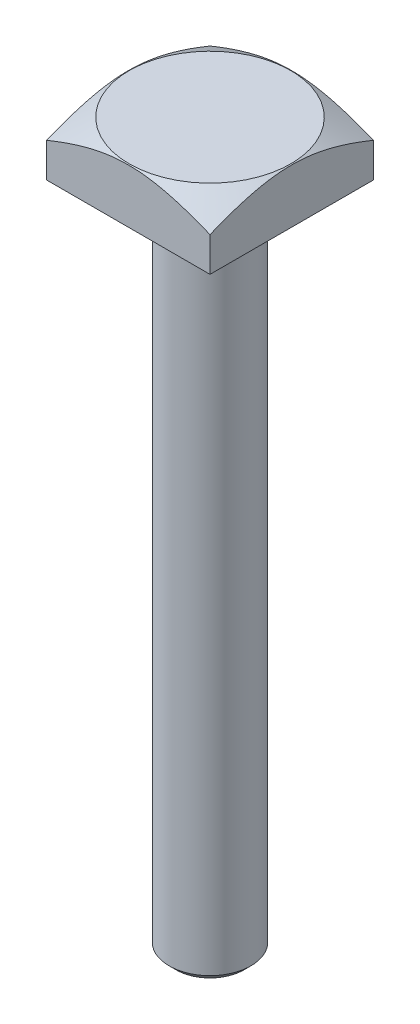
ISO-10303-21;
HEADER;
FILE_DESCRIPTION(('STEP AP214'),'2;1');
FILE_NAME('part.step','',(''),(''),'','','');
FILE_SCHEMA(('AUTOMOTIVE_DESIGN { 1 0 10303 214 1 1 1 1 }'));
ENDSEC;
DATA;
#1=APPLICATION_CONTEXT('core data for automotive mechanical design processes');
#2=APPLICATION_PROTOCOL_DEFINITION('international standard','automotive_design',2000,#1);
#3=PRODUCT_CONTEXT('',#1,'mechanical');
#4=PRODUCT('Part','Part','',(#3));
#5=PRODUCT_RELATED_PRODUCT_CATEGORY('part','',(#4));
#6=PRODUCT_DEFINITION_FORMATION('','',#4);
#7=PRODUCT_DEFINITION_CONTEXT('part definition',#1,'design');
#8=PRODUCT_DEFINITION('design','',#6,#7);
#9=PRODUCT_DEFINITION_SHAPE('','',#8);
#10=(LENGTH_UNIT() NAMED_UNIT(*) SI_UNIT(.MILLI.,.METRE.));
#11=(NAMED_UNIT(*) PLANE_ANGLE_UNIT() SI_UNIT($,.RADIAN.));
#12=(NAMED_UNIT(*) SI_UNIT($,.STERADIAN.) SOLID_ANGLE_UNIT());
#13=UNCERTAINTY_MEASURE_WITH_UNIT(LENGTH_MEASURE(1.E-05),#10,'distance_accuracy_value','');
#14=(GEOMETRIC_REPRESENTATION_CONTEXT(3) GLOBAL_UNCERTAINTY_ASSIGNED_CONTEXT((#13)) GLOBAL_UNIT_ASSIGNED_CONTEXT((#10,
#11,#12)) REPRESENTATION_CONTEXT('',''));
#15=CARTESIAN_POINT('',(0.,0.,0.));
#16=DIRECTION('',(0.,0.,1.));
#17=DIRECTION('',(1.,0.,0.));
#18=AXIS2_PLACEMENT_3D('',#15,#16,#17);
#19=CARTESIAN_POINT('',(12.,8.,-12.));
#20=DIRECTION('',(-1.,0.,0.));
#21=DIRECTION('',(0.,0.,1.));
#22=AXIS2_PLACEMENT_3D('',#19,#20,#21);
#23=PLANE('',#22);
#24=CARTESIAN_POINT('',(12.,-7.755830649675,37.2802409115802));
#25=CARTESIAN_POINT('',(12.,-7.30241454304762,36.4551629177045));
#26=CARTESIAN_POINT('',(12.,-6.85003759237768,35.6295114864057));
#27=CARTESIAN_POINT('',(12.,-5.94791925450552,33.9767562738539));
#28=CARTESIAN_POINT('',(12.,-5.49817790221136,33.1496524735522));
#29=CARTESIAN_POINT('',(12.,-4.60165489076007,31.4932559321793));
#30=CARTESIAN_POINT('',(12.,-4.15487498514848,30.6639622412243));
#31=CARTESIAN_POINT('',(12.,-3.26531610211714,29.0032360151955));
#32=CARTESIAN_POINT('',(12.,-2.82253710291332,28.1718034917988));
#33=CARTESIAN_POINT('',(12.,-1.93297438809273,26.4891505562822));
#34=CARTESIAN_POINT('',(12.,-1.48629542789472,25.6378746856343));
#35=CARTESIAN_POINT('',(12.,-0.599734399658517,23.9317937330327));
#36=CARTESIAN_POINT('',(12.,-0.159852287589864,23.0769886739867));
#37=CARTESIAN_POINT('',(12.,0.710859758166972,21.3630193062337));
#38=CARTESIAN_POINT('',(12.,1.14169182072157,20.5038560831051));
#39=CARTESIAN_POINT('',(12.,1.77882260657401,19.2106313435901));
#40=CARTESIAN_POINT('',(12.,1.98967781207068,18.7788143491524));
#41=CARTESIAN_POINT('',(12.,2.40780038432779,17.9134482002784));
#42=CARTESIAN_POINT('',(12.,2.61506777620249,17.4798990579932));
#43=CARTESIAN_POINT('',(12.,3.03000425677916,16.6009712662702));
#44=CARTESIAN_POINT('',(12.,3.23757644887203,16.1555468057721));
#45=CARTESIAN_POINT('',(12.,3.64741511531173,15.2622675195519));
#46=CARTESIAN_POINT('',(12.,3.84968167212273,14.8144127317346));
#47=CARTESIAN_POINT('',(12.,4.24787985761422,13.9157332902921));
#48=CARTESIAN_POINT('',(12.,4.44380962845693,13.4649078115174));
#49=CARTESIAN_POINT('',(12.,4.82789729255058,12.5599509818219));
#50=CARTESIAN_POINT('',(12.,5.01605522286551,12.105819646679));
#51=CARTESIAN_POINT('',(12.,5.38216202035867,11.1954668212976));
#52=CARTESIAN_POINT('',(12.,5.56014726145397,10.7392600191031));
#53=CARTESIAN_POINT('',(12.,5.90453004084652,9.82245526618768));
#54=CARTESIAN_POINT('',(12.,6.07092714966156,9.36185715343337));
#55=CARTESIAN_POINT('',(12.,6.38938626877827,8.43583546512396));
#56=CARTESIAN_POINT('',(12.,6.54145237658143,7.9704133113556));
#57=CARTESIAN_POINT('',(12.,6.8279838170143,7.03423462562651));
#58=CARTESIAN_POINT('',(12.,6.962451081352,6.56347868529376));
#59=CARTESIAN_POINT('',(12.,7.25763009813,5.43365829223021));
#60=CARTESIAN_POINT('',(12.,7.40849398410238,4.77191925666861));
#61=CARTESIAN_POINT('',(12.,7.59535070976626,3.772085443082));
#62=CARTESIAN_POINT('',(12.,7.65106048199936,3.43762789346317));
#63=CARTESIAN_POINT('',(12.,7.74802179763537,2.76659531974961));
#64=CARTESIAN_POINT('',(12.,7.78927342363181,2.43002030776228));
#65=CARTESIAN_POINT('',(12.,7.85600273437088,1.75724545998452));
#66=CARTESIAN_POINT('',(12.,7.88156933724223,1.421054499667));
#67=CARTESIAN_POINT('',(12.,7.91655140035061,0.747830808754621));
#68=CARTESIAN_POINT('',(12.,7.92596714576254,0.410798093127814));
#69=CARTESIAN_POINT('',(12.,7.92835804465415,-0.263326108606828));
#70=CARTESIAN_POINT('',(12.,7.92133327195475,-0.600417594443979));
#71=CARTESIAN_POINT('',(12.,7.89106337574009,-1.27387197433406));
#72=CARTESIAN_POINT('',(12.,7.86781759091782,-1.6102348381213));
#73=CARTESIAN_POINT('',(12.,7.79672553128797,-2.37944693684561));
#74=CARTESIAN_POINT('',(12.,7.74368116579182,-2.81181972831901));
#75=CARTESIAN_POINT('',(12.,7.61399690734149,-3.67300629551294));
#76=CARTESIAN_POINT('',(12.,7.53735399363033,-4.10181960837781));
#77=CARTESIAN_POINT('',(12.,7.36332659079184,-4.95555764845053));
#78=CARTESIAN_POINT('',(12.,7.26592428654824,-5.38047870668094));
#79=CARTESIAN_POINT('',(12.,7.05344369590148,-6.2258292267736));
#80=CARTESIAN_POINT('',(12.,6.93836565245686,-6.64625875028845));
#81=CARTESIAN_POINT('',(12.,6.69082941504958,-7.49137732991198));
#82=CARTESIAN_POINT('',(12.,6.55806129598559,-7.91597496421117));
#83=CARTESIAN_POINT('',(12.,6.27969141105413,-8.76091736794835));
#84=CARTESIAN_POINT('',(12.,6.1340895937559,-9.1812621203355));
#85=CARTESIAN_POINT('',(12.,5.83233533866863,-10.0179335154725));
#86=CARTESIAN_POINT('',(12.,5.67618727983331,-10.4342617448728));
#87=CARTESIAN_POINT('',(12.,5.35511246911133,-11.26349957583));
#88=CARTESIAN_POINT('',(12.,5.19018581950202,-11.6764092171512));
#89=CARTESIAN_POINT('',(12.,4.78869511646332,-12.6563085401857));
#90=CARTESIAN_POINT('',(12.,4.54882012355107,-13.2219396121394));
#91=CARTESIAN_POINT('',(12.,4.05823270102751,-14.3484956884947));
#92=CARTESIAN_POINT('',(12.,3.80751964000225,-14.9094204164304));
#93=CARTESIAN_POINT('',(12.,3.29748935255508,-16.0274761772401));
#94=CARTESIAN_POINT('',(12.,3.03817033707768,-16.584606391907));
#95=CARTESIAN_POINT('',(12.,2.51270633552729,-17.6956167271159));
#96=CARTESIAN_POINT('',(12.,2.24656148938847,-18.2494969140001));
#97=CARTESIAN_POINT('',(12.,1.70847111747003,-19.3551374256665));
#98=CARTESIAN_POINT('',(12.,1.43651987068159,-19.9068949615636));
#99=CARTESIAN_POINT('',(12.,0.888093164661973,-21.0081568104106));
#100=CARTESIAN_POINT('',(12.,0.611617686686798,-21.5576611140134));
#101=CARTESIAN_POINT('',(12.,0.0549648637203552,-22.65470566547));
#102=CARTESIAN_POINT('',(12.,-0.225212027326439,-23.2022461438864));
#103=CARTESIAN_POINT('',(12.,-0.788685850139737,-24.2957201475609));
#104=CARTESIAN_POINT('',(12.,-1.07198279255229,-24.8416536673277));
#105=CARTESIAN_POINT('',(12.,-1.87797024125886,-26.3857842190039));
#106=CARTESIAN_POINT('',(12.,-2.40374020345778,-27.3823738119501));
#107=CARTESIAN_POINT('',(12.,-3.46181277844356,-29.3721143135459));
#108=CARTESIAN_POINT('',(12.,-3.99411561013151,-30.3652651055318));
#109=CARTESIAN_POINT('',(12.,-5.06248323800288,-32.3466044950721));
#110=CARTESIAN_POINT('',(12.,-5.59853662597048,-33.3347992479941));
#111=CARTESIAN_POINT('',(12.,-6.4055105495303,-34.8154803125457));
#112=CARTESIAN_POINT('',(12.,-6.67497744690058,-35.308759945488));
#113=CARTESIAN_POINT('',(12.,-7.21477867756769,-36.2948435561037));
#114=CARTESIAN_POINT('',(12.,-7.48511300972371,-36.7876475344015));
#115=CARTESIAN_POINT('',(12.,-7.755830649675,-37.2802409115802));
#116=B_SPLINE_CURVE_WITH_KNOTS('',3,(#24,#25,#26,#27,#28,#29,#30,#31,#32,#33,#34,#35,#36,#37,
#38,#39,#40,#41,#42,#43,#44,#45,#46,#47,#48,#49,#50,#51,#52,#53,#54,#55,#56,#57,#58,#59,#60,#61,
#62,#63,#64,#65,#66,#67,#68,#69,#70,#71,#72,#73,#74,#75,#76,#77,#78,#79,#80,#81,#82,#83,#84,#85,
#86,#87,#88,#89,#90,#91,#92,#93,#94,#95,#96,#97,#98,#99,#100,#101,#102,#103,#104,#105,#106,#107,
#108,#109,#110,#111,#112,#113,#114,#115),.UNSPECIFIED.,.F.,.F.,(4,2,2,2,2,2,2,2,2,2,2,2,2,2,2,2,
2,2,2,2,2,2,2,2,2,2,2,2,2,2,2,2,2,2,2,2,2,2,2,2,2,2,2,2,2,4),(0.,2.824371092826,
5.64877950979768,8.47473290004721,11.3006708943163,14.1846949859908,17.0687003869168,
19.9520196017731,21.3936488559899,22.8352680148885,24.30948561783,25.7836802937782,
27.2583033310779,28.7329193350716,30.2018819629076,31.6708990048569,33.1394947448832,
34.6079291514902,36.6421016751555,37.6590399606409,38.675972436675,39.6870853426842,
40.6981803953388,41.7092709080008,42.7204026437565,44.0264893648571,45.3327433425173,
46.640122856494,47.9474844017407,49.2818529918624,50.616226929678,51.9500501821787,
53.28385789801,55.1268804595321,56.9700105386138,58.8135262084138,60.6570041150507,
62.5023908663634,64.3477852650985,66.1929554061944,68.0381318452193,71.4184238723544,
74.7988294760449,78.1714929325083,79.8577410403608,81.54398693145),.UNSPECIFIED.);
#117=CARTESIAN_POINT('',(12.,5.05753764692432,12.));
#118=VERTEX_POINT('',#117);
#119=CARTESIAN_POINT('',(12.,5.05753764692432,-12.));
#120=VERTEX_POINT('',#119);
#121=EDGE_CURVE('E83',#118,#120,#116,.T.);
#122=ORIENTED_EDGE('',*,*,#121,.F.);
#123=DIRECTION('',(0.,-1.,0.));
#124=VECTOR('',#123,1.);
#125=CARTESIAN_POINT('',(12.,8.,12.));
#126=LINE('',#125,#124);
#127=CARTESIAN_POINT('',(12.,0.,12.));
#128=VERTEX_POINT('',#127);
#129=EDGE_CURVE('E64',#118,#128,#126,.T.);
#130=ORIENTED_EDGE('',*,*,#129,.T.);
#131=DIRECTION('',(0.,0.,-1.));
#132=VECTOR('',#131,1.);
#133=CARTESIAN_POINT('',(12.,0.,-12.));
#134=LINE('',#133,#132);
#135=CARTESIAN_POINT('',(12.,0.,-12.));
#136=VERTEX_POINT('',#135);
#137=EDGE_CURVE('E91',#128,#136,#134,.T.);
#138=ORIENTED_EDGE('',*,*,#137,.T.);
#139=DIRECTION('',(0.,-1.,0.));
#140=VECTOR('',#139,1.);
#141=CARTESIAN_POINT('',(12.,8.,-12.));
#142=LINE('',#141,#140);
#143=EDGE_CURVE('E90',#120,#136,#142,.T.);
#144=ORIENTED_EDGE('',*,*,#143,.F.);
#145=EDGE_LOOP('',(#122,#130,#138,#144));
#146=FACE_BOUND('',#145,.T.);
#147=ADVANCED_FACE('F40',(#146),#23,.F.);
#148=CARTESIAN_POINT('',(-12.,8.,-12.));
#149=DIRECTION('',(0.,0.,1.));
#150=DIRECTION('',(1.,0.,0.));
#151=AXIS2_PLACEMENT_3D('',#148,#149,#150);
#152=PLANE('',#151);
#153=CARTESIAN_POINT('',(37.2802409115802,-7.755830649675,-12.));
#154=CARTESIAN_POINT('',(36.4551629177045,-7.30241454304762,-12.));
#155=CARTESIAN_POINT('',(35.6295114864057,-6.85003759237767,-12.));
#156=CARTESIAN_POINT('',(33.9767562738539,-5.94791925450552,-12.));
#157=CARTESIAN_POINT('',(33.1496524735522,-5.49817790221136,-12.));
#158=CARTESIAN_POINT('',(31.4932559321792,-4.60165489076007,-12.));
#159=CARTESIAN_POINT('',(30.6639622412243,-4.15487498514848,-12.));
#160=CARTESIAN_POINT('',(29.0032360151955,-3.26531610211713,-12.));
#161=CARTESIAN_POINT('',(28.1718034917988,-2.82253710291331,-12.));
#162=CARTESIAN_POINT('',(26.4891505562821,-1.93297438809272,-12.));
#163=CARTESIAN_POINT('',(25.6378746856343,-1.48629542789471,-12.));
#164=CARTESIAN_POINT('',(23.9317937330326,-0.59973439965851,-12.));
#165=CARTESIAN_POINT('',(23.0769886739867,-0.159852287589854,-12.));
#166=CARTESIAN_POINT('',(21.3630193062336,0.710859758166982,-12.));
#167=CARTESIAN_POINT('',(20.5038560831051,1.14169182072158,-12.));
#168=CARTESIAN_POINT('',(19.2106313435901,1.77882260657402,-12.));
#169=CARTESIAN_POINT('',(18.7788143491524,1.98967781207069,-12.));
#170=CARTESIAN_POINT('',(17.9134482002784,2.40780038432779,-12.));
#171=CARTESIAN_POINT('',(17.4798990579932,2.61506777620249,-12.));
#172=CARTESIAN_POINT('',(16.6009712662702,3.03000425677916,-12.));
#173=CARTESIAN_POINT('',(16.1555468057721,3.23757644887203,-12.));
#174=CARTESIAN_POINT('',(15.2622675195519,3.64741511531173,-12.));
#175=CARTESIAN_POINT('',(14.8144127317346,3.84968167212273,-12.));
#176=CARTESIAN_POINT('',(13.9157332902921,4.24787985761421,-12.));
#177=CARTESIAN_POINT('',(13.4649078115174,4.44380962845693,-12.));
#178=CARTESIAN_POINT('',(12.559950981822,4.82789729255058,-12.));
#179=CARTESIAN_POINT('',(12.105819646679,5.01605522286551,-12.));
#180=CARTESIAN_POINT('',(11.1954668212976,5.38216202035867,-12.));
#181=CARTESIAN_POINT('',(10.7392600191031,5.56014726145396,-12.));
#182=CARTESIAN_POINT('',(9.82245526618769,5.90453004084652,-12.));
#183=CARTESIAN_POINT('',(9.36185715343338,6.07092714966155,-12.));
#184=CARTESIAN_POINT('',(8.43583546512397,6.38938626877827,-12.));
#185=CARTESIAN_POINT('',(7.9704133113556,6.54145237658143,-12.));
#186=CARTESIAN_POINT('',(7.03423462562651,6.8279838170143,-12.));
#187=CARTESIAN_POINT('',(6.56347868529376,6.962451081352,-12.));
#188=CARTESIAN_POINT('',(5.43365829223021,7.25763009813,-12.));
#189=CARTESIAN_POINT('',(4.77191925666861,7.40849398410238,-12.));
#190=CARTESIAN_POINT('',(3.772085443082,7.59535070976626,-12.));
#191=CARTESIAN_POINT('',(3.43762789346316,7.65106048199936,-12.));
#192=CARTESIAN_POINT('',(2.76659531974961,7.74802179763537,-12.));
#193=CARTESIAN_POINT('',(2.43002030776228,7.78927342363181,-12.));
#194=CARTESIAN_POINT('',(1.75724545998451,7.85600273437088,-12.));
#195=CARTESIAN_POINT('',(1.421054499667,7.88156933724223,-12.));
#196=CARTESIAN_POINT('',(0.74783080875462,7.91655140035061,-12.));
#197=CARTESIAN_POINT('',(0.410798093127815,7.92596714576254,-12.));
#198=CARTESIAN_POINT('',(-0.263326108606826,7.92835804465415,-12.));
#199=CARTESIAN_POINT('',(-0.600417594443977,7.92133327195475,-12.));
#200=CARTESIAN_POINT('',(-1.27387197433406,7.89106337574009,-12.));
#201=CARTESIAN_POINT('',(-1.6102348381213,7.86781759091782,-12.));
#202=CARTESIAN_POINT('',(-2.3794469368456,7.79672553128797,-12.));
#203=CARTESIAN_POINT('',(-2.811819728319,7.74368116579182,-12.));
#204=CARTESIAN_POINT('',(-3.67300629551293,7.6139969073415,-12.));
#205=CARTESIAN_POINT('',(-4.10181960837781,7.53735399363033,-12.));
#206=CARTESIAN_POINT('',(-4.95555764845052,7.36332659079185,-12.));
#207=CARTESIAN_POINT('',(-5.38047870668094,7.26592428654824,-12.));
#208=CARTESIAN_POINT('',(-6.2258292267736,7.05344369590148,-12.));
#209=CARTESIAN_POINT('',(-6.64625875028845,6.93836565245686,-12.));
#210=CARTESIAN_POINT('',(-7.49137732991197,6.69082941504958,-12.));
#211=CARTESIAN_POINT('',(-7.91597496421116,6.55806129598559,-12.));
#212=CARTESIAN_POINT('',(-8.76091736794835,6.27969141105413,-12.));
#213=CARTESIAN_POINT('',(-9.18126212033549,6.13408959375591,-12.));
#214=CARTESIAN_POINT('',(-10.0179335154725,5.83233533866863,-12.));
#215=CARTESIAN_POINT('',(-10.4342617448728,5.67618727983331,-12.));
#216=CARTESIAN_POINT('',(-11.26349957583,5.35511246911133,-12.));
#217=CARTESIAN_POINT('',(-11.6764092171512,5.19018581950202,-12.));
#218=CARTESIAN_POINT('',(-12.6563085401857,4.78869511646333,-12.));
#219=CARTESIAN_POINT('',(-13.2219396121394,4.54882012355107,-12.));
#220=CARTESIAN_POINT('',(-14.3484956884947,4.05823270102751,-12.));
#221=CARTESIAN_POINT('',(-14.9094204164304,3.80751964000225,-12.));
#222=CARTESIAN_POINT('',(-16.0274761772401,3.29748935255508,-12.));
#223=CARTESIAN_POINT('',(-16.584606391907,3.03817033707768,-12.));
#224=CARTESIAN_POINT('',(-17.6956167271159,2.51270633552729,-12.));
#225=CARTESIAN_POINT('',(-18.2494969140001,2.24656148938847,-12.));
#226=CARTESIAN_POINT('',(-19.3551374256665,1.70847111747003,-12.));
#227=CARTESIAN_POINT('',(-19.9068949615636,1.43651987068158,-12.));
#228=CARTESIAN_POINT('',(-21.0081568104106,0.88809316466197,-12.));
#229=CARTESIAN_POINT('',(-21.5576611140134,0.611617686686792,-12.));
#230=CARTESIAN_POINT('',(-22.65470566547,0.0549648637203485,-12.));
#231=CARTESIAN_POINT('',(-23.2022461438864,-0.225212027326445,-12.));
#232=CARTESIAN_POINT('',(-24.2957201475609,-0.788685850139742,-12.));
#233=CARTESIAN_POINT('',(-24.8416536673277,-1.0719827925523,-12.));
#234=CARTESIAN_POINT('',(-26.3857842190039,-1.87797024125887,-12.));
#235=CARTESIAN_POINT('',(-27.3823738119501,-2.40374020345779,-12.));
#236=CARTESIAN_POINT('',(-29.3721143135459,-3.46181277844357,-12.));
#237=CARTESIAN_POINT('',(-30.3652651055318,-3.99411561013151,-12.));
#238=CARTESIAN_POINT('',(-32.3466044950721,-5.06248323800288,-12.));
#239=CARTESIAN_POINT('',(-33.3347992479941,-5.59853662597048,-12.));
#240=CARTESIAN_POINT('',(-34.8154803125457,-6.4055105495303,-12.));
#241=CARTESIAN_POINT('',(-35.308759945488,-6.67497744690058,-12.));
#242=CARTESIAN_POINT('',(-36.2948435561037,-7.21477867756769,-12.));
#243=CARTESIAN_POINT('',(-36.7876475344015,-7.48511300972371,-12.));
#244=CARTESIAN_POINT('',(-37.2802409115802,-7.755830649675,-12.));
#245=B_SPLINE_CURVE_WITH_KNOTS('',3,(#153,#154,#155,#156,#157,#158,#159,#160,#161,#162,#163,
#164,#165,#166,#167,#168,#169,#170,#171,#172,#173,#174,#175,#176,#177,#178,#179,#180,#181,#182,
#183,#184,#185,#186,#187,#188,#189,#190,#191,#192,#193,#194,#195,#196,#197,#198,#199,#200,#201,
#202,#203,#204,#205,#206,#207,#208,#209,#210,#211,#212,#213,#214,#215,#216,#217,#218,#219,#220,
#221,#222,#223,#224,#225,#226,#227,#228,#229,#230,#231,#232,#233,#234,#235,#236,#237,#238,#239,
#240,#241,#242,#243,#244),.UNSPECIFIED.,.F.,.F.,(4,2,2,2,2,2,2,2,2,2,2,2,2,2,2,2,2,2,2,2,2,2,2,
2,2,2,2,2,2,2,2,2,2,2,2,2,2,2,2,2,2,2,2,2,2,4),(0.,2.82437109282601,5.64877950979768,
8.47473290004722,11.3006708943163,14.1846949859908,17.0687003869169,19.9520196017732,
21.3936488559899,22.8352680148885,24.30948561783,25.7836802937782,27.2583033310779,
28.7329193350716,30.2018819629076,31.6708990048569,33.1394947448832,34.6079291514902,
36.6421016751555,37.659039960641,38.675972436675,39.6870853426842,40.6981803953388,
41.7092709080008,42.7204026437565,44.0264893648571,45.3327433425173,46.640122856494,
47.9474844017407,49.2818529918624,50.616226929678,51.9500501821787,53.28385789801,
55.1268804595321,56.9700105386138,58.8135262084139,60.6570041150507,62.5023908663634,
64.3477852650985,66.1929554061944,68.0381318452193,71.4184238723544,74.7988294760449,
78.1714929325083,79.8577410403608,81.54398693145),.UNSPECIFIED.);
#246=CARTESIAN_POINT('',(-12.,5.05753764692432,-12.));
#247=VERTEX_POINT('',#246);
#248=EDGE_CURVE('E92',#120,#247,#245,.T.);
#249=ORIENTED_EDGE('',*,*,#248,.F.);
#250=ORIENTED_EDGE('',*,*,#143,.T.);
#251=DIRECTION('',(-1.,0.,0.));
#252=VECTOR('',#251,1.);
#253=CARTESIAN_POINT('',(-12.,0.,-12.));
#254=LINE('',#253,#252);
#255=CARTESIAN_POINT('',(-12.,0.,-12.));
#256=VERTEX_POINT('',#255);
#257=EDGE_CURVE('E262',#136,#256,#254,.T.);
#258=ORIENTED_EDGE('',*,*,#257,.T.);
#259=DIRECTION('',(0.,-1.,0.));
#260=VECTOR('',#259,1.);
#261=CARTESIAN_POINT('',(-12.,8.,-12.));
#262=LINE('',#261,#260);
#263=EDGE_CURVE('E100',#247,#256,#262,.T.);
#264=ORIENTED_EDGE('',*,*,#263,.F.);
#265=EDGE_LOOP('',(#249,#250,#258,#264));
#266=FACE_BOUND('',#265,.T.);
#267=ADVANCED_FACE('F154',(#266),#152,.F.);
#268=CARTESIAN_POINT('',(-12.,8.,-12.));
#269=DIRECTION('',(1.,0.,0.));
#270=DIRECTION('',(0.,0.,-1.));
#271=AXIS2_PLACEMENT_3D('',#268,#269,#270);
#272=PLANE('',#271);
#273=CARTESIAN_POINT('',(-12.,-7.755830649675,-37.2802409115802));
#274=CARTESIAN_POINT('',(-12.,-7.30241454304762,-36.4551629177045));
#275=CARTESIAN_POINT('',(-12.,-6.85003759237767,-35.6295114864057));
#276=CARTESIAN_POINT('',(-12.,-5.94791925450552,-33.9767562738539));
#277=CARTESIAN_POINT('',(-12.,-5.49817790221136,-33.1496524735522));
#278=CARTESIAN_POINT('',(-12.,-4.60165489076007,-31.4932559321792));
#279=CARTESIAN_POINT('',(-12.,-4.15487498514847,-30.6639622412243));
#280=CARTESIAN_POINT('',(-12.,-3.26531610211712,-29.0032360151955));
#281=CARTESIAN_POINT('',(-12.,-2.82253710291331,-28.1718034917988));
#282=CARTESIAN_POINT('',(-12.,-1.93297438809272,-26.4891505562821));
#283=CARTESIAN_POINT('',(-12.,-1.48629542789471,-25.6378746856343));
#284=CARTESIAN_POINT('',(-12.,-0.599734399658513,-23.9317937330327));
#285=CARTESIAN_POINT('',(-12.,-0.159852287589857,-23.0769886739867));
#286=CARTESIAN_POINT('',(-12.,0.710859758166979,-21.3630193062336));
#287=CARTESIAN_POINT('',(-12.,1.14169182072158,-20.5038560831051));
#288=CARTESIAN_POINT('',(-12.,1.77882260657401,-19.2106313435901));
#289=CARTESIAN_POINT('',(-12.,1.98967781207069,-18.7788143491524));
#290=CARTESIAN_POINT('',(-12.,2.40780038432779,-17.9134482002784));
#291=CARTESIAN_POINT('',(-12.,2.61506777620249,-17.4798990579932));
#292=CARTESIAN_POINT('',(-12.,3.03000425677916,-16.6009712662702));
#293=CARTESIAN_POINT('',(-12.,3.23757644887203,-16.1555468057721));
#294=CARTESIAN_POINT('',(-12.,3.64741511531173,-15.2622675195519));
#295=CARTESIAN_POINT('',(-12.,3.84968167212273,-14.8144127317346));
#296=CARTESIAN_POINT('',(-12.,4.24787985761422,-13.9157332902921));
#297=CARTESIAN_POINT('',(-12.,4.44380962845693,-13.4649078115174));
#298=CARTESIAN_POINT('',(-12.,4.82789729255058,-12.5599509818219));
#299=CARTESIAN_POINT('',(-12.,5.01605522286551,-12.105819646679));
#300=CARTESIAN_POINT('',(-12.,5.38216202035867,-11.1954668212976));
#301=CARTESIAN_POINT('',(-12.,5.56014726145397,-10.7392600191031));
#302=CARTESIAN_POINT('',(-12.,5.90453004084652,-9.82245526618768));
#303=CARTESIAN_POINT('',(-12.,6.07092714966156,-9.36185715343337));
#304=CARTESIAN_POINT('',(-12.,6.38938626877827,-8.43583546512396));
#305=CARTESIAN_POINT('',(-12.,6.54145237658143,-7.9704133113556));
#306=CARTESIAN_POINT('',(-12.,6.8279838170143,-7.03423462562651));
#307=CARTESIAN_POINT('',(-12.,6.962451081352,-6.56347868529376));
#308=CARTESIAN_POINT('',(-12.,7.25763009813,-5.43365829223021));
#309=CARTESIAN_POINT('',(-12.,7.40849398410238,-4.77191925666861));
#310=CARTESIAN_POINT('',(-12.,7.59535070976626,-3.772085443082));
#311=CARTESIAN_POINT('',(-12.,7.65106048199936,-3.43762789346317));
#312=CARTESIAN_POINT('',(-12.,7.74802179763537,-2.76659531974961));
#313=CARTESIAN_POINT('',(-12.,7.78927342363181,-2.43002030776228));
#314=CARTESIAN_POINT('',(-12.,7.85600273437088,-1.75724545998451));
#315=CARTESIAN_POINT('',(-12.,7.88156933724223,-1.421054499667));
#316=CARTESIAN_POINT('',(-12.,7.91655140035061,-0.747830808754618));
#317=CARTESIAN_POINT('',(-12.,7.92596714576254,-0.410798093127812));
#318=CARTESIAN_POINT('',(-12.,7.92835804465415,0.26332610860683));
#319=CARTESIAN_POINT('',(-12.,7.92133327195476,0.600417594443982));
#320=CARTESIAN_POINT('',(-12.,7.89106337574009,1.27387197433407));
#321=CARTESIAN_POINT('',(-12.,7.86781759091782,1.6102348381213));
#322=CARTESIAN_POINT('',(-12.,7.79672553128797,2.37944693684561));
#323=CARTESIAN_POINT('',(-12.,7.74368116579182,2.81181972831901));
#324=CARTESIAN_POINT('',(-12.,7.6139969073415,3.67300629551294));
#325=CARTESIAN_POINT('',(-12.,7.53735399363033,4.10181960837782));
#326=CARTESIAN_POINT('',(-12.,7.36332659079184,4.95555764845053));
#327=CARTESIAN_POINT('',(-12.,7.26592428654824,5.38047870668095));
#328=CARTESIAN_POINT('',(-12.,7.05344369590148,6.22582922677361));
#329=CARTESIAN_POINT('',(-12.,6.93836565245686,6.64625875028845));
#330=CARTESIAN_POINT('',(-12.,6.69082941504958,7.49137732991198));
#331=CARTESIAN_POINT('',(-12.,6.55806129598559,7.91597496421117));
#332=CARTESIAN_POINT('',(-12.,6.27969141105413,8.76091736794836));
#333=CARTESIAN_POINT('',(-12.,6.1340895937559,9.18126212033551));
#334=CARTESIAN_POINT('',(-12.,5.83233533866863,10.0179335154725));
#335=CARTESIAN_POINT('',(-12.,5.67618727983331,10.4342617448728));
#336=CARTESIAN_POINT('',(-12.,5.35511246911133,11.26349957583));
#337=CARTESIAN_POINT('',(-12.,5.19018581950202,11.6764092171512));
#338=CARTESIAN_POINT('',(-12.,4.78869511646332,12.6563085401857));
#339=CARTESIAN_POINT('',(-12.,4.54882012355107,13.2219396121394));
#340=CARTESIAN_POINT('',(-12.,4.05823270102751,14.3484956884947));
#341=CARTESIAN_POINT('',(-12.,3.80751964000225,14.9094204164304));
#342=CARTESIAN_POINT('',(-12.,3.29748935255508,16.0274761772401));
#343=CARTESIAN_POINT('',(-12.,3.03817033707768,16.584606391907));
#344=CARTESIAN_POINT('',(-12.,2.51270633552729,17.6956167271159));
#345=CARTESIAN_POINT('',(-12.,2.24656148938847,18.2494969140001));
#346=CARTESIAN_POINT('',(-12.,1.70847111747003,19.3551374256665));
#347=CARTESIAN_POINT('',(-12.,1.43651987068158,19.9068949615636));
#348=CARTESIAN_POINT('',(-12.,0.888093164661969,21.0081568104106));
#349=CARTESIAN_POINT('',(-12.,0.611617686686792,21.5576611140134));
#350=CARTESIAN_POINT('',(-12.,0.0549648637203487,22.65470566547));
#351=CARTESIAN_POINT('',(-12.,-0.225212027326444,23.2022461438864));
#352=CARTESIAN_POINT('',(-12.,-0.788685850139741,24.2957201475609));
#353=CARTESIAN_POINT('',(-12.,-1.07198279255229,24.8416536673277));
#354=CARTESIAN_POINT('',(-12.,-1.87797024125887,26.3857842190039));
#355=CARTESIAN_POINT('',(-12.,-2.40374020345778,27.3823738119501));
#356=CARTESIAN_POINT('',(-12.,-3.46181277844357,29.3721143135459));
#357=CARTESIAN_POINT('',(-12.,-3.99411561013151,30.3652651055318));
#358=CARTESIAN_POINT('',(-12.,-5.06248323800288,32.3466044950721));
#359=CARTESIAN_POINT('',(-12.,-5.59853662597048,33.3347992479941));
#360=CARTESIAN_POINT('',(-12.,-6.4055105495303,34.8154803125457));
#361=CARTESIAN_POINT('',(-12.,-6.67497744690058,35.308759945488));
#362=CARTESIAN_POINT('',(-12.,-7.21477867756769,36.2948435561037));
#363=CARTESIAN_POINT('',(-12.,-7.48511300972371,36.7876475344015));
#364=CARTESIAN_POINT('',(-12.,-7.755830649675,37.2802409115802));
#365=B_SPLINE_CURVE_WITH_KNOTS('',3,(#273,#274,#275,#276,#277,#278,#279,#280,#281,#282,#283,
#284,#285,#286,#287,#288,#289,#290,#291,#292,#293,#294,#295,#296,#297,#298,#299,#300,#301,#302,
#303,#304,#305,#306,#307,#308,#309,#310,#311,#312,#313,#314,#315,#316,#317,#318,#319,#320,#321,
#322,#323,#324,#325,#326,#327,#328,#329,#330,#331,#332,#333,#334,#335,#336,#337,#338,#339,#340,
#341,#342,#343,#344,#345,#346,#347,#348,#349,#350,#351,#352,#353,#354,#355,#356,#357,#358,#359,
#360,#361,#362,#363,#364),.UNSPECIFIED.,.F.,.F.,(4,2,2,2,2,2,2,2,2,2,2,2,2,2,2,2,2,2,2,2,2,2,2,
2,2,2,2,2,2,2,2,2,2,2,2,2,2,2,2,2,2,2,2,2,2,4),(0.,2.82437109282601,5.64877950979769,
8.47473290004723,11.3006708943163,14.1846949859908,17.0687003869168,19.9520196017731,
21.3936488559899,22.8352680148885,24.30948561783,25.7836802937782,27.2583033310779,
28.7329193350716,30.2018819629076,31.6708990048569,33.1394947448832,34.6079291514902,
36.6421016751555,37.6590399606409,38.675972436675,39.6870853426842,40.6981803953388,
41.7092709080008,42.7204026437565,44.0264893648571,45.3327433425173,46.640122856494,
47.9474844017407,49.2818529918624,50.616226929678,51.9500501821787,53.28385789801,
55.1268804595321,56.9700105386138,58.8135262084138,60.6570041150507,62.5023908663634,
64.3477852650985,66.1929554061944,68.0381318452193,71.4184238723544,74.7988294760449,
78.1714929325083,79.8577410403608,81.54398693145),.UNSPECIFIED.);
#366=CARTESIAN_POINT('',(-12.,5.05753764692432,12.));
#367=VERTEX_POINT('',#366);
#368=EDGE_CURVE('E56',#247,#367,#365,.T.);
#369=ORIENTED_EDGE('',*,*,#368,.F.);
#370=ORIENTED_EDGE('',*,*,#263,.T.);
#371=DIRECTION('',(0.,0.,1.));
#372=VECTOR('',#371,1.);
#373=CARTESIAN_POINT('',(-12.,0.,-12.));
#374=LINE('',#373,#372);
#375=CARTESIAN_POINT('',(-12.,0.,12.));
#376=VERTEX_POINT('',#375);
#377=EDGE_CURVE('E102',#256,#376,#374,.T.);
#378=ORIENTED_EDGE('',*,*,#377,.T.);
#379=DIRECTION('',(0.,-1.,0.));
#380=VECTOR('',#379,1.);
#381=CARTESIAN_POINT('',(-12.,8.,12.));
#382=LINE('',#381,#380);
#383=EDGE_CURVE('E98',#367,#376,#382,.T.);
#384=ORIENTED_EDGE('',*,*,#383,.F.);
#385=EDGE_LOOP('',(#369,#370,#378,#384));
#386=FACE_BOUND('',#385,.T.);
#387=ADVANCED_FACE('F157',(#386),#272,.F.);
#388=CARTESIAN_POINT('',(-12.,8.,12.));
#389=DIRECTION('',(0.,0.,-1.));
#390=DIRECTION('',(-1.,0.,0.));
#391=AXIS2_PLACEMENT_3D('',#388,#389,#390);
#392=PLANE('',#391);
#393=CARTESIAN_POINT('',(-37.2802409115802,-7.755830649675,12.));
#394=CARTESIAN_POINT('',(-36.4551629177045,-7.30241454304762,12.));
#395=CARTESIAN_POINT('',(-35.6295114864057,-6.85003759237767,12.));
#396=CARTESIAN_POINT('',(-33.9767562738539,-5.94791925450552,12.));
#397=CARTESIAN_POINT('',(-33.1496524735522,-5.49817790221136,12.));
#398=CARTESIAN_POINT('',(-31.4932559321792,-4.60165489076007,12.));
#399=CARTESIAN_POINT('',(-30.6639622412243,-4.15487498514847,12.));
#400=CARTESIAN_POINT('',(-29.0032360151955,-3.26531610211712,12.));
#401=CARTESIAN_POINT('',(-28.1718034917988,-2.82253710291331,12.));
#402=CARTESIAN_POINT('',(-26.4891505562821,-1.93297438809272,12.));
#403=CARTESIAN_POINT('',(-25.6378746856343,-1.48629542789472,12.));
#404=CARTESIAN_POINT('',(-23.9317937330326,-0.599734399658513,12.));
#405=CARTESIAN_POINT('',(-23.0769886739867,-0.159852287589855,12.));
#406=CARTESIAN_POINT('',(-21.3630193062336,0.710859758166983,12.));
#407=CARTESIAN_POINT('',(-20.5038560831051,1.14169182072158,12.));
#408=CARTESIAN_POINT('',(-19.2106313435901,1.77882260657402,12.));
#409=CARTESIAN_POINT('',(-18.7788143491524,1.98967781207069,12.));
#410=CARTESIAN_POINT('',(-17.9134482002784,2.40780038432779,12.));
#411=CARTESIAN_POINT('',(-17.4798990579932,2.61506777620249,12.));
#412=CARTESIAN_POINT('',(-16.6009712662702,3.03000425677916,12.));
#413=CARTESIAN_POINT('',(-16.1555468057721,3.23757644887203,12.));
#414=CARTESIAN_POINT('',(-15.2622675195519,3.64741511531173,12.));
#415=CARTESIAN_POINT('',(-14.8144127317346,3.84968167212273,12.));
#416=CARTESIAN_POINT('',(-13.9157332902921,4.24787985761422,12.));
#417=CARTESIAN_POINT('',(-13.4649078115174,4.44380962845693,12.));
#418=CARTESIAN_POINT('',(-12.559950981822,4.82789729255058,12.));
#419=CARTESIAN_POINT('',(-12.105819646679,5.01605522286551,12.));
#420=CARTESIAN_POINT('',(-11.1954668212976,5.38216202035867,12.));
#421=CARTESIAN_POINT('',(-10.7392600191031,5.56014726145396,12.));
#422=CARTESIAN_POINT('',(-9.82245526618769,5.90453004084652,12.));
#423=CARTESIAN_POINT('',(-9.36185715343337,6.07092714966156,12.));
#424=CARTESIAN_POINT('',(-8.43583546512397,6.38938626877827,12.));
#425=CARTESIAN_POINT('',(-7.9704133113556,6.54145237658143,12.));
#426=CARTESIAN_POINT('',(-7.03423462562651,6.8279838170143,12.));
#427=CARTESIAN_POINT('',(-6.56347868529376,6.962451081352,12.));
#428=CARTESIAN_POINT('',(-5.43365829223021,7.25763009813,12.));
#429=CARTESIAN_POINT('',(-4.77191925666861,7.40849398410238,12.));
#430=CARTESIAN_POINT('',(-3.772085443082,7.59535070976626,12.));
#431=CARTESIAN_POINT('',(-3.43762789346316,7.65106048199936,12.));
#432=CARTESIAN_POINT('',(-2.76659531974961,7.74802179763537,12.));
#433=CARTESIAN_POINT('',(-2.43002030776228,7.78927342363181,12.));
#434=CARTESIAN_POINT('',(-1.75724545998451,7.85600273437088,12.));
#435=CARTESIAN_POINT('',(-1.421054499667,7.88156933724223,12.));
#436=CARTESIAN_POINT('',(-0.747830808754617,7.91655140035061,12.));
#437=CARTESIAN_POINT('',(-0.41079809312781,7.92596714576254,12.));
#438=CARTESIAN_POINT('',(0.263326108606833,7.92835804465415,12.));
#439=CARTESIAN_POINT('',(0.600417594443984,7.92133327195475,12.));
#440=CARTESIAN_POINT('',(1.27387197433407,7.89106337574009,12.));
#441=CARTESIAN_POINT('',(1.6102348381213,7.86781759091782,12.));
#442=CARTESIAN_POINT('',(2.3794469368456,7.79672553128797,12.));
#443=CARTESIAN_POINT('',(2.811819728319,7.74368116579182,12.));
#444=CARTESIAN_POINT('',(3.67300629551293,7.6139969073415,12.));
#445=CARTESIAN_POINT('',(4.10181960837781,7.53735399363033,12.));
#446=CARTESIAN_POINT('',(4.95555764845052,7.36332659079185,12.));
#447=CARTESIAN_POINT('',(5.38047870668093,7.26592428654824,12.));
#448=CARTESIAN_POINT('',(6.2258292267736,7.05344369590148,12.));
#449=CARTESIAN_POINT('',(6.64625875028844,6.93836565245686,12.));
#450=CARTESIAN_POINT('',(7.49137732991197,6.69082941504958,12.));
#451=CARTESIAN_POINT('',(7.91597496421116,6.55806129598559,12.));
#452=CARTESIAN_POINT('',(8.76091736794835,6.27969141105413,12.));
#453=CARTESIAN_POINT('',(9.18126212033549,6.13408959375591,12.));
#454=CARTESIAN_POINT('',(10.0179335154725,5.83233533866863,12.));
#455=CARTESIAN_POINT('',(10.4342617448728,5.67618727983331,12.));
#456=CARTESIAN_POINT('',(11.26349957583,5.35511246911133,12.));
#457=CARTESIAN_POINT('',(11.6764092171512,5.19018581950202,12.));
#458=CARTESIAN_POINT('',(12.6563085401857,4.78869511646333,12.));
#459=CARTESIAN_POINT('',(13.2219396121394,4.54882012355107,12.));
#460=CARTESIAN_POINT('',(14.3484956884947,4.05823270102751,12.));
#461=CARTESIAN_POINT('',(14.9094204164304,3.80751964000225,12.));
#462=CARTESIAN_POINT('',(16.0274761772401,3.29748935255508,12.));
#463=CARTESIAN_POINT('',(16.584606391907,3.03817033707768,12.));
#464=CARTESIAN_POINT('',(17.6956167271159,2.51270633552729,12.));
#465=CARTESIAN_POINT('',(18.2494969140001,2.24656148938847,12.));
#466=CARTESIAN_POINT('',(19.3551374256665,1.70847111747003,12.));
#467=CARTESIAN_POINT('',(19.9068949615636,1.43651987068158,12.));
#468=CARTESIAN_POINT('',(21.0081568104106,0.888093164661972,12.));
#469=CARTESIAN_POINT('',(21.5576611140134,0.611617686686796,12.));
#470=CARTESIAN_POINT('',(22.65470566547,0.054964863720353,12.));
#471=CARTESIAN_POINT('',(23.2022461438864,-0.22521202732644,12.));
#472=CARTESIAN_POINT('',(24.2957201475609,-0.788685850139737,12.));
#473=CARTESIAN_POINT('',(24.8416536673277,-1.07198279255229,12.));
#474=CARTESIAN_POINT('',(26.3857842190039,-1.87797024125886,12.));
#475=CARTESIAN_POINT('',(27.3823738119501,-2.40374020345778,12.));
#476=CARTESIAN_POINT('',(29.3721143135459,-3.46181277844356,12.));
#477=CARTESIAN_POINT('',(30.3652651055318,-3.9941156101315,12.));
#478=CARTESIAN_POINT('',(32.3466044950721,-5.06248323800288,12.));
#479=CARTESIAN_POINT('',(33.3347992479941,-5.59853662597049,12.));
#480=CARTESIAN_POINT('',(34.8154803125457,-6.4055105495303,12.));
#481=CARTESIAN_POINT('',(35.308759945488,-6.67497744690058,12.));
#482=CARTESIAN_POINT('',(36.2948435561037,-7.21477867756769,12.));
#483=CARTESIAN_POINT('',(36.7876475344015,-7.48511300972371,12.));
#484=CARTESIAN_POINT('',(37.2802409115802,-7.75583064967501,12.));
#485=B_SPLINE_CURVE_WITH_KNOTS('',3,(#393,#394,#395,#396,#397,#398,#399,#400,#401,#402,#403,
#404,#405,#406,#407,#408,#409,#410,#411,#412,#413,#414,#415,#416,#417,#418,#419,#420,#421,#422,
#423,#424,#425,#426,#427,#428,#429,#430,#431,#432,#433,#434,#435,#436,#437,#438,#439,#440,#441,
#442,#443,#444,#445,#446,#447,#448,#449,#450,#451,#452,#453,#454,#455,#456,#457,#458,#459,#460,
#461,#462,#463,#464,#465,#466,#467,#468,#469,#470,#471,#472,#473,#474,#475,#476,#477,#478,#479,
#480,#481,#482,#483,#484),.UNSPECIFIED.,.F.,.F.,(4,2,2,2,2,2,2,2,2,2,2,2,2,2,2,2,2,2,2,2,2,2,2,
2,2,2,2,2,2,2,2,2,2,2,2,2,2,2,2,2,2,2,2,2,2,4),(0.,2.82437109282601,5.64877950979769,
8.47473290004723,11.3006708943163,14.1846949859908,17.0687003869169,19.9520196017732,
21.3936488559899,22.8352680148885,24.30948561783,25.7836802937782,27.2583033310779,
28.7329193350716,30.2018819629076,31.6708990048569,33.1394947448832,34.6079291514902,
36.6421016751555,37.659039960641,38.675972436675,39.6870853426842,40.6981803953388,
41.7092709080008,42.7204026437565,44.0264893648571,45.3327433425173,46.640122856494,
47.9474844017407,49.2818529918624,50.616226929678,51.9500501821787,53.2838578980099,
55.1268804595321,56.9700105386138,58.8135262084138,60.6570041150507,62.5023908663634,
64.3477852650985,66.1929554061944,68.0381318452193,71.4184238723544,74.7988294760449,
78.1714929325083,79.8577410403608,81.54398693145),.UNSPECIFIED.);
#486=EDGE_CURVE('E81',#367,#118,#485,.T.);
#487=ORIENTED_EDGE('',*,*,#486,.F.);
#488=ORIENTED_EDGE('',*,*,#383,.T.);
#489=DIRECTION('',(1.,0.,0.));
#490=VECTOR('',#489,1.);
#491=CARTESIAN_POINT('',(-12.,0.,12.));
#492=LINE('',#491,#490);
#493=EDGE_CURVE('E96',#376,#128,#492,.T.);
#494=ORIENTED_EDGE('',*,*,#493,.T.);
#495=ORIENTED_EDGE('',*,*,#129,.F.);
#496=EDGE_LOOP('',(#487,#488,#494,#495));
#497=FACE_BOUND('',#496,.T.);
#498=ADVANCED_FACE('F94',(#497),#392,.F.);
#499=CARTESIAN_POINT('',(0.,0.,0.));
#500=DIRECTION('',(0.,1.,0.));
#501=DIRECTION('',(0.,0.,1.));
#502=AXIS2_PLACEMENT_3D('',#499,#500,#501);
#503=PLANE('',#502);
#504=CARTESIAN_POINT('',(0.,0.,0.));
#505=DIRECTION('',(0.,-1.,0.));
#506=DIRECTION('',(0.,0.,-1.));
#507=AXIS2_PLACEMENT_3D('',#504,#505,#506);
#508=CIRCLE('',#507,6.);
#509=CARTESIAN_POINT('',(0.,0.,-6.));
#510=VERTEX_POINT('',#509);
#511=EDGE_CURVE('E107',#510,#510,#508,.T.);
#512=ORIENTED_EDGE('',*,*,#511,.F.);
#513=EDGE_LOOP('',(#512));
#514=FACE_BOUND('',#513,.T.);
#515=ORIENTED_EDGE('',*,*,#137,.F.);
#516=ORIENTED_EDGE('',*,*,#493,.F.);
#517=ORIENTED_EDGE('',*,*,#377,.F.);
#518=ORIENTED_EDGE('',*,*,#257,.F.);
#519=EDGE_LOOP('',(#515,#516,#517,#518));
#520=FACE_BOUND('',#519,.T.);
#521=ADVANCED_FACE('F137',(#514,#520),#503,.F.);
#522=CARTESIAN_POINT('',(0.,8.,0.));
#523=DIRECTION('',(0.,-1.,0.));
#524=DIRECTION('',(0.,0.,1.));
#525=AXIS2_PLACEMENT_3D('',#522,#523,#524);
#526=CONICAL_SURFACE('',#525,11.8740684535914,1.0471975511966);
#527=CARTESIAN_POINT('',(0.,8.,0.));
#528=DIRECTION('',(0.,1.,0.));
#529=DIRECTION('',(0.,0.,1.));
#530=AXIS2_PLACEMENT_3D('',#527,#528,#529);
#531=CIRCLE('',#530,11.8740684535914);
#532=CARTESIAN_POINT('',(0.,8.,11.8740684535914));
#533=VERTEX_POINT('',#532);
#534=EDGE_CURVE('E87',#533,#533,#531,.T.);
#535=ORIENTED_EDGE('',*,*,#534,.F.);
#536=EDGE_LOOP('',(#535));
#537=FACE_BOUND('',#536,.T.);
#538=ORIENTED_EDGE('',*,*,#121,.T.);
#539=ORIENTED_EDGE('',*,*,#248,.T.);
#540=ORIENTED_EDGE('',*,*,#368,.T.);
#541=ORIENTED_EDGE('',*,*,#486,.T.);
#542=EDGE_LOOP('',(#538,#539,#540,#541));
#543=FACE_BOUND('',#542,.T.);
#544=ADVANCED_FACE('F82',(#537,#543),#526,.T.);
#545=CARTESIAN_POINT('',(0.,8.,0.));
#546=DIRECTION('',(0.,1.,0.));
#547=DIRECTION('',(0.,0.,1.));
#548=AXIS2_PLACEMENT_3D('',#545,#546,#547);
#549=PLANE('',#548);
#550=ORIENTED_EDGE('',*,*,#534,.T.);
#551=EDGE_LOOP('',(#550));
#552=FACE_BOUND('',#551,.T.);
#553=ADVANCED_FACE('F136',(#552),#549,.T.);
#554=CARTESIAN_POINT('',(0.,-98.,0.));
#555=DIRECTION('',(0.,1.,0.));
#556=DIRECTION('',(0.,0.,1.));
#557=AXIS2_PLACEMENT_3D('',#554,#555,#556);
#558=CYLINDRICAL_SURFACE('',#557,6.);
#559=CARTESIAN_POINT('',(0.,-97.,0.));
#560=DIRECTION('',(0.,-1.,0.));
#561=DIRECTION('',(0.,0.,-1.));
#562=AXIS2_PLACEMENT_3D('',#559,#560,#561);
#563=CIRCLE('',#562,6.);
#564=CARTESIAN_POINT('',(0.,-97.,-6.));
#565=VERTEX_POINT('',#564);
#566=EDGE_CURVE('E12',#565,#565,#563,.F.);
#567=ORIENTED_EDGE('',*,*,#566,.T.);
#568=EDGE_LOOP('',(#567));
#569=FACE_BOUND('',#568,.T.);
#570=ORIENTED_EDGE('',*,*,#511,.T.);
#571=EDGE_LOOP('',(#570));
#572=FACE_BOUND('',#571,.T.);
#573=ADVANCED_FACE('F139',(#569,#572),#558,.T.);
#574=CARTESIAN_POINT('',(0.,-98.,0.));
#575=DIRECTION('',(0.,-1.,0.));
#576=DIRECTION('',(0.,0.,-1.));
#577=AXIS2_PLACEMENT_3D('',#574,#575,#576);
#578=PLANE('',#577);
#579=CARTESIAN_POINT('',(0.,-98.,0.));
#580=DIRECTION('',(0.,-1.,0.));
#581=DIRECTION('',(0.,0.,-1.));
#582=AXIS2_PLACEMENT_3D('',#579,#580,#581);
#583=CIRCLE('',#582,4.99999999999999);
#584=CARTESIAN_POINT('',(0.,-98.,-4.99999999999999));
#585=VERTEX_POINT('',#584);
#586=EDGE_CURVE('E49',#585,#585,#583,.T.);
#587=ORIENTED_EDGE('',*,*,#586,.T.);
#588=EDGE_LOOP('',(#587));
#589=FACE_BOUND('',#588,.T.);
#590=ADVANCED_FACE('F201',(#589),#578,.T.);
#591=CARTESIAN_POINT('',(0.,-98.,0.));
#592=DIRECTION('',(0.,1.,0.));
#593=DIRECTION('',(0.,0.,1.));
#594=AXIS2_PLACEMENT_3D('',#591,#592,#593);
#595=CONICAL_SURFACE('',#594,4.99999999999999,0.785398163397446);
#596=ORIENTED_EDGE('',*,*,#566,.F.);
#597=EDGE_LOOP('',(#596));
#598=FACE_BOUND('',#597,.T.);
#599=ORIENTED_EDGE('',*,*,#586,.F.);
#600=EDGE_LOOP('',(#599));
#601=FACE_BOUND('',#600,.T.);
#602=ADVANCED_FACE('F43',(#598,#601),#595,.T.);
#603=CLOSED_SHELL('',(#147,#267,#387,#498,#521,#544,#553,#573,#590,#602));
#604=MANIFOLD_SOLID_BREP('B2',#603);
#605=ADVANCED_BREP_SHAPE_REPRESENTATION('',(#18,#604),#14);
#606=SHAPE_DEFINITION_REPRESENTATION(#9,#605);
ENDSEC;
END-ISO-10303-21;
